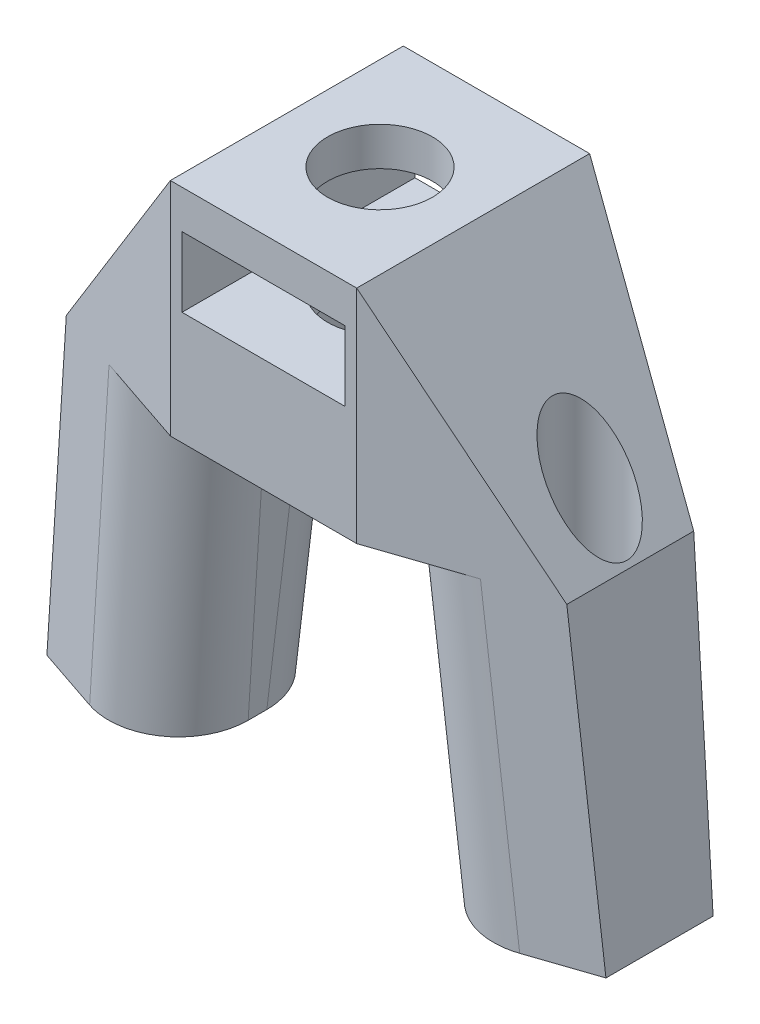
ISO-10303-21;
HEADER;
FILE_DESCRIPTION(('STEP AP214'),'2;1');
FILE_NAME('part.step','',(''),(''),'','','');
FILE_SCHEMA(('AUTOMOTIVE_DESIGN { 1 0 10303 214 1 1 1 1 }'));
ENDSEC;
DATA;
#1=APPLICATION_CONTEXT('core data for automotive mechanical design processes');
#2=APPLICATION_PROTOCOL_DEFINITION('international standard','automotive_design',2000,#1);
#3=PRODUCT_CONTEXT('',#1,'mechanical');
#4=PRODUCT('Part','Part','',(#3));
#5=PRODUCT_RELATED_PRODUCT_CATEGORY('part','',(#4));
#6=PRODUCT_DEFINITION_FORMATION('','',#4);
#7=PRODUCT_DEFINITION_CONTEXT('part definition',#1,'design');
#8=PRODUCT_DEFINITION('design','',#6,#7);
#9=PRODUCT_DEFINITION_SHAPE('','',#8);
#10=(LENGTH_UNIT() NAMED_UNIT(*) SI_UNIT(.MILLI.,.METRE.));
#11=(NAMED_UNIT(*) PLANE_ANGLE_UNIT() SI_UNIT($,.RADIAN.));
#12=(NAMED_UNIT(*) SI_UNIT($,.STERADIAN.) SOLID_ANGLE_UNIT());
#13=UNCERTAINTY_MEASURE_WITH_UNIT(LENGTH_MEASURE(1.E-05),#10,'distance_accuracy_value','');
#14=(GEOMETRIC_REPRESENTATION_CONTEXT(3) GLOBAL_UNCERTAINTY_ASSIGNED_CONTEXT((#13)) GLOBAL_UNIT_ASSIGNED_CONTEXT((#10,
#11,#12)) REPRESENTATION_CONTEXT('',''));
#15=CARTESIAN_POINT('',(0.,0.,0.));
#16=DIRECTION('',(0.,0.,1.));
#17=DIRECTION('',(1.,0.,0.));
#18=AXIS2_PLACEMENT_3D('',#15,#16,#17);
#19=CARTESIAN_POINT('',(0.,0.,-5.));
#20=DIRECTION('',(0.,0.,-1.));
#21=DIRECTION('',(-1.,0.,0.));
#22=AXIS2_PLACEMENT_3D('',#19,#20,#21);
#23=PLANE('',#22);
#24=DIRECTION('',(0.,-1.,0.));
#25=VECTOR('',#24,1.);
#26=CARTESIAN_POINT('',(3.5,0.,-5.));
#27=LINE('',#26,#25);
#28=CARTESIAN_POINT('',(3.5,15.0638674027608,-5.));
#29=VERTEX_POINT('',#28);
#30=CARTESIAN_POINT('',(3.5,12.0638674027608,-5.));
#31=VERTEX_POINT('',#30);
#32=EDGE_CURVE('E353',#29,#31,#27,.T.);
#33=ORIENTED_EDGE('',*,*,#32,.F.);
#34=DIRECTION('',(1.,0.,0.));
#35=VECTOR('',#34,1.);
#36=CARTESIAN_POINT('',(0.,15.0638674027608,-5.));
#37=LINE('',#36,#35);
#38=CARTESIAN_POINT('',(-3.5,15.0638674027608,-5.));
#39=VERTEX_POINT('',#38);
#40=EDGE_CURVE('E231',#39,#29,#37,.T.);
#41=ORIENTED_EDGE('',*,*,#40,.F.);
#42=DIRECTION('',(0.,1.,0.));
#43=VECTOR('',#42,1.);
#44=CARTESIAN_POINT('',(-3.5,0.,-5.));
#45=LINE('',#44,#43);
#46=CARTESIAN_POINT('',(-3.5,12.0638674027608,-5.));
#47=VERTEX_POINT('',#46);
#48=EDGE_CURVE('E350',#47,#39,#45,.T.);
#49=ORIENTED_EDGE('',*,*,#48,.F.);
#50=DIRECTION('',(-1.,0.,0.));
#51=VECTOR('',#50,1.);
#52=CARTESIAN_POINT('',(0.,12.0638674027608,-5.));
#53=LINE('',#52,#51);
#54=EDGE_CURVE('E236',#31,#47,#53,.T.);
#55=ORIENTED_EDGE('',*,*,#54,.F.);
#56=EDGE_LOOP('',(#33,#41,#49,#55));
#57=FACE_BOUND('',#56,.T.);
#58=DIRECTION('',(1.,0.,0.));
#59=VECTOR('',#58,1.);
#60=CARTESIAN_POINT('',(-4.,7.21386740276083,-5.));
#61=LINE('',#60,#59);
#62=CARTESIAN_POINT('',(-4.,7.21386740276083,-5.));
#63=VERTEX_POINT('',#62);
#64=CARTESIAN_POINT('',(4.,7.21386740276075,-5.));
#65=VERTEX_POINT('',#64);
#66=EDGE_CURVE('E219',#63,#65,#61,.T.);
#67=ORIENTED_EDGE('',*,*,#66,.F.);
#68=DIRECTION('',(0.,-1.,0.));
#69=VECTOR('',#68,1.);
#70=CARTESIAN_POINT('',(-4.,16.7138674027608,-5.));
#71=LINE('',#70,#69);
#72=CARTESIAN_POINT('',(-4.,16.7138674027608,-5.));
#73=VERTEX_POINT('',#72);
#74=EDGE_CURVE('E368',#73,#63,#71,.T.);
#75=ORIENTED_EDGE('',*,*,#74,.F.);
#76=DIRECTION('',(-1.,0.,0.));
#77=VECTOR('',#76,1.);
#78=CARTESIAN_POINT('',(-4.,16.7138674027608,-5.));
#79=LINE('',#78,#77);
#80=CARTESIAN_POINT('',(4.,16.7138674027608,-5.));
#81=VERTEX_POINT('',#80);
#82=EDGE_CURVE('E202',#81,#73,#79,.T.);
#83=ORIENTED_EDGE('',*,*,#82,.F.);
#84=DIRECTION('',(0.,-1.,0.));
#85=VECTOR('',#84,1.);
#86=CARTESIAN_POINT('',(4.,16.7138674027608,-5.));
#87=LINE('',#86,#85);
#88=EDGE_CURVE('E308',#81,#65,#87,.T.);
#89=ORIENTED_EDGE('',*,*,#88,.T.);
#90=EDGE_LOOP('',(#67,#75,#83,#89));
#91=FACE_BOUND('',#90,.T.);
#92=ADVANCED_FACE('F32',(#57,#91),#23,.T.);
#93=CARTESIAN_POINT('',(0.,0.,5.));
#94=DIRECTION('',(0.,0.,-1.));
#95=DIRECTION('',(-1.,0.,0.));
#96=AXIS2_PLACEMENT_3D('',#93,#94,#95);
#97=PLANE('',#96);
#98=DIRECTION('',(-1.,0.,0.));
#99=VECTOR('',#98,1.);
#100=CARTESIAN_POINT('',(-3.5,15.0638674027608,5.));
#101=LINE('',#100,#99);
#102=CARTESIAN_POINT('',(3.5,15.0638674027608,5.));
#103=VERTEX_POINT('',#102);
#104=CARTESIAN_POINT('',(-3.5,15.0638674027608,5.));
#105=VERTEX_POINT('',#104);
#106=EDGE_CURVE('E331',#103,#105,#101,.T.);
#107=ORIENTED_EDGE('',*,*,#106,.F.);
#108=DIRECTION('',(0.,1.,0.));
#109=VECTOR('',#108,1.);
#110=CARTESIAN_POINT('',(3.5,12.0638674027608,5.));
#111=LINE('',#110,#109);
#112=CARTESIAN_POINT('',(3.5,12.0638674027608,5.));
#113=VERTEX_POINT('',#112);
#114=EDGE_CURVE('E329',#113,#103,#111,.T.);
#115=ORIENTED_EDGE('',*,*,#114,.F.);
#116=DIRECTION('',(1.,0.,0.));
#117=VECTOR('',#116,1.);
#118=CARTESIAN_POINT('',(-3.5,12.0638674027608,5.));
#119=LINE('',#118,#117);
#120=CARTESIAN_POINT('',(-3.5,12.0638674027608,5.));
#121=VERTEX_POINT('',#120);
#122=EDGE_CURVE('E337',#121,#113,#119,.T.);
#123=ORIENTED_EDGE('',*,*,#122,.F.);
#124=DIRECTION('',(0.,-1.,0.));
#125=VECTOR('',#124,1.);
#126=CARTESIAN_POINT('',(-3.5,12.0638674027608,5.));
#127=LINE('',#126,#125);
#128=EDGE_CURVE('E334',#105,#121,#127,.T.);
#129=ORIENTED_EDGE('',*,*,#128,.F.);
#130=EDGE_LOOP('',(#107,#115,#123,#129));
#131=FACE_BOUND('',#130,.T.);
#132=DIRECTION('',(0.,-1.,0.));
#133=VECTOR('',#132,1.);
#134=CARTESIAN_POINT('',(-4.,16.7138674027608,5.));
#135=LINE('',#134,#133);
#136=CARTESIAN_POINT('',(-4.,16.7138674027608,5.));
#137=VERTEX_POINT('',#136);
#138=CARTESIAN_POINT('',(-3.99999999999998,7.21386740276123,5.00000000000001));
#139=VERTEX_POINT('',#138);
#140=EDGE_CURVE('E168',#137,#139,#135,.T.);
#141=ORIENTED_EDGE('',*,*,#140,.T.);
#142=DIRECTION('',(1.,0.,0.));
#143=VECTOR('',#142,1.);
#144=CARTESIAN_POINT('',(-4.,7.21386740276083,5.));
#145=LINE('',#144,#143);
#146=CARTESIAN_POINT('',(3.99999999999998,7.21386740276123,5.00000000000001));
#147=VERTEX_POINT('',#146);
#148=EDGE_CURVE('E216',#139,#147,#145,.T.);
#149=ORIENTED_EDGE('',*,*,#148,.T.);
#150=DIRECTION('',(0.,-1.,0.));
#151=VECTOR('',#150,1.);
#152=CARTESIAN_POINT('',(4.,16.7138674027608,5.));
#153=LINE('',#152,#151);
#154=CARTESIAN_POINT('',(4.,16.7138674027608,5.));
#155=VERTEX_POINT('',#154);
#156=EDGE_CURVE('E206',#155,#147,#153,.T.);
#157=ORIENTED_EDGE('',*,*,#156,.F.);
#158=DIRECTION('',(1.,0.,0.));
#159=VECTOR('',#158,1.);
#160=CARTESIAN_POINT('',(-4.,16.7138674027608,5.));
#161=LINE('',#160,#159);
#162=EDGE_CURVE('E200',#137,#155,#161,.T.);
#163=ORIENTED_EDGE('',*,*,#162,.F.);
#164=EDGE_LOOP('',(#141,#149,#157,#163));
#165=FACE_BOUND('',#164,.T.);
#166=ADVANCED_FACE('F205',(#131,#165),#97,.F.);
#167=CARTESIAN_POINT('',(-10.7436401353757,7.18802311367852,29.3515913237718));
#168=DIRECTION('',(-0.816179352712969,0.577798636382122,0.));
#169=DIRECTION('',(-0.577798636382122,-0.816179352712969,0.));
#170=AXIS2_PLACEMENT_3D('',#167,#168,#169);
#171=PLANE('',#170);
#172=CARTESIAN_POINT('',(-9.,9.65103182890533,0.));
#173=DIRECTION('',(-0.816179352712969,0.577798636382122,0.));
#174=DIRECTION('',(-0.577798636382122,-0.816179352712969,0.));
#175=AXIS2_PLACEMENT_3D('',#172,#173,#174);
#176=ELLIPSE('',#175,2.7691307996474,1.6);
#177=CARTESIAN_POINT('',(-10.6,7.39092444527157,0.));
#178=VERTEX_POINT('',#177);
#179=EDGE_CURVE('E383',#178,#178,#176,.F.);
#180=ORIENTED_EDGE('',*,*,#179,.T.);
#181=EDGE_LOOP('',(#180));
#182=FACE_BOUND('',#181,.T.);
#183=DIRECTION('',(0.,0.,-1.));
#184=VECTOR('',#183,1.);
#185=CARTESIAN_POINT('',(-10.7436401353757,7.18802311367852,29.3515913237718));
#186=LINE('',#185,#184);
#187=CARTESIAN_POINT('',(-10.7436401353757,7.18802311367852,2.72402145431069));
#188=VERTEX_POINT('',#187);
#189=CARTESIAN_POINT('',(-10.7436401353757,7.18802311367852,-2.72402145431069));
#190=VERTEX_POINT('',#189);
#191=EDGE_CURVE('E191',#188,#190,#186,.T.);
#192=ORIENTED_EDGE('',*,*,#191,.F.);
#193=DIRECTION('',(0.567116171588462,0.801089654240746,0.191401707911106));
#194=VECTOR('',#193,1.);
#195=CARTESIAN_POINT('',(-7.85329720687722,11.2708264848867,3.69951219267894));
#196=LINE('',#195,#194);
#197=EDGE_CURVE('E173',#188,#137,#196,.T.);
#198=ORIENTED_EDGE('',*,*,#197,.T.);
#199=DIRECTION('',(0.,0.,1.));
#200=VECTOR('',#199,1.);
#201=CARTESIAN_POINT('',(-4.,16.7138674027608,5.));
#202=LINE('',#201,#200);
#203=EDGE_CURVE('E189',#73,#137,#202,.T.);
#204=ORIENTED_EDGE('',*,*,#203,.F.);
#205=DIRECTION('',(-0.567116171588462,-0.801089654240746,0.191401707911106));
#206=VECTOR('',#205,1.);
#207=CARTESIAN_POINT('',(-14.2253517983208,2.2698717154873,-1.54894376806672));
#208=LINE('',#207,#206);
#209=EDGE_CURVE('E378',#73,#190,#208,.T.);
#210=ORIENTED_EDGE('',*,*,#209,.T.);
#211=EDGE_LOOP('',(#192,#198,#204,#210));
#212=FACE_BOUND('',#211,.T.);
#213=ADVANCED_FACE('F187',(#182,#212),#171,.T.);
#214=CARTESIAN_POINT('',(-12.,-6.28613259723917,29.3515913237718));
#215=DIRECTION('',(-0.995681087961558,0.0928394909275632,0.));
#216=DIRECTION('',(-0.0928394909275632,-0.995681087961558,0.));
#217=AXIS2_PLACEMENT_3D('',#214,#215,#216);
#218=PLANE('',#217);
#219=DIRECTION('',(0.,0.,-1.));
#220=VECTOR('',#219,1.);
#221=CARTESIAN_POINT('',(-12.,-6.28613259723917,29.3515913237718));
#222=LINE('',#221,#220);
#223=CARTESIAN_POINT('',(-12.,-6.28613259723917,2.3));
#224=VERTEX_POINT('',#223);
#225=CARTESIAN_POINT('',(-12.,-6.28613259723917,-2.3));
#226=VERTEX_POINT('',#225);
#227=EDGE_CURVE('E313',#224,#226,#222,.T.);
#228=ORIENTED_EDGE('',*,*,#227,.F.);
#229=DIRECTION('',(0.0927939505980937,0.995192678941438,0.0313179583268566));
#230=VECTOR('',#229,1.);
#231=CARTESIAN_POINT('',(-11.9213849084719,-5.44300475281822,2.32653259339073));
#232=LINE('',#231,#230);
#233=EDGE_CURVE('E193',#224,#188,#232,.T.);
#234=ORIENTED_EDGE('',*,*,#233,.T.);
#235=ORIENTED_EDGE('',*,*,#191,.T.);
#236=DIRECTION('',(-0.0927939505980937,-0.995192678941438,0.0313179583268566));
#237=VECTOR('',#236,1.);
#238=CARTESIAN_POINT('',(-12.0919832300861,-7.27263049475301,-2.26895565984596));
#239=LINE('',#238,#237);
#240=EDGE_CURVE('E180',#190,#226,#239,.T.);
#241=ORIENTED_EDGE('',*,*,#240,.T.);
#242=EDGE_LOOP('',(#228,#234,#235,#241));
#243=FACE_BOUND('',#242,.T.);
#244=ADVANCED_FACE('F413',(#243),#218,.T.);
#245=CARTESIAN_POINT('',(-5.25876964288639,-6.28613259723917,29.3515913237718));
#246=DIRECTION('',(0.,-1.,0.));
#247=DIRECTION('',(1.,0.,0.));
#248=AXIS2_PLACEMENT_3D('',#245,#246,#247);
#249=PLANE('',#248);
#250=CARTESIAN_POINT('',(-9.00000000000001,-6.28613259723917,0.));
#251=DIRECTION('',(0.,1.,0.));
#252=DIRECTION('',(-1.,0.,0.));
#253=AXIS2_PLACEMENT_3D('',#250,#251,#252);
#254=CIRCLE('',#253,1.6);
#255=CARTESIAN_POINT('',(-10.6,-6.28613259723917,0.));
#256=VERTEX_POINT('',#255);
#257=EDGE_CURVE('E192',#256,#256,#254,.T.);
#258=ORIENTED_EDGE('',*,*,#257,.T.);
#259=EDGE_LOOP('',(#258));
#260=FACE_BOUND('',#259,.T.);
#261=DIRECTION('',(0.947492278987199,0.,-0.31977864415818));
#262=VECTOR('',#261,1.);
#263=CARTESIAN_POINT('',(-4.,-6.28613259723917,-5.));
#264=LINE('',#263,#262);
#265=CARTESIAN_POINT('',(-9.23111851321019,-6.28613259723917,-3.23449750179156));
#266=VERTEX_POINT('',#265);
#267=EDGE_CURVE('E370',#226,#266,#264,.T.);
#268=ORIENTED_EDGE('',*,*,#267,.T.);
#269=CARTESIAN_POINT('',(-8.27178258073565,-6.28613259723917,-0.392020664829971));
#270=DIRECTION('',(0.,-1.,0.));
#271=DIRECTION('',(0.947492278987199,0.,-0.31977864415818));
#272=AXIS2_PLACEMENT_3D('',#269,#270,#271);
#273=ELLIPSE('',#272,3.01449162908938,3.);
#274=CARTESIAN_POINT('',(-5.25876964288639,-6.28613259723917,-0.400785429793018));
#275=VERTEX_POINT('',#274);
#276=EDGE_CURVE('E258',#266,#275,#273,.T.);
#277=ORIENTED_EDGE('',*,*,#276,.T.);
#278=DIRECTION('',(0.,0.,-1.));
#279=VECTOR('',#278,1.);
#280=CARTESIAN_POINT('',(-5.25876964288639,-6.28613259723917,29.3515913237718));
#281=LINE('',#280,#279);
#282=CARTESIAN_POINT('',(-5.25876964288639,-6.28613259723917,0.400785429793014));
#283=VERTEX_POINT('',#282);
#284=EDGE_CURVE('E386',#283,#275,#281,.T.);
#285=ORIENTED_EDGE('',*,*,#284,.F.);
#286=CARTESIAN_POINT('',(-8.27178258073565,-6.28613259723917,0.392020664829965));
#287=DIRECTION('',(0.,-1.,0.));
#288=DIRECTION('',(-0.947492278987199,0.,-0.319778644158179));
#289=AXIS2_PLACEMENT_3D('',#286,#287,#288);
#290=ELLIPSE('',#289,3.01449162908938,3.);
#291=CARTESIAN_POINT('',(-9.23111851321019,-6.28613259723917,3.23449750179156));
#292=VERTEX_POINT('',#291);
#293=EDGE_CURVE('E256',#283,#292,#290,.T.);
#294=ORIENTED_EDGE('',*,*,#293,.T.);
#295=DIRECTION('',(-0.947492278987199,0.,-0.319778644158179));
#296=VECTOR('',#295,1.);
#297=CARTESIAN_POINT('',(-12.,-6.28613259723917,2.3));
#298=LINE('',#297,#296);
#299=EDGE_CURVE('E181',#292,#224,#298,.T.);
#300=ORIENTED_EDGE('',*,*,#299,.T.);
#301=ORIENTED_EDGE('',*,*,#227,.T.);
#302=EDGE_LOOP('',(#268,#277,#285,#294,#300,#301));
#303=FACE_BOUND('',#302,.T.);
#304=ADVANCED_FACE('F405',(#260,#303),#249,.T.);
#305=CARTESIAN_POINT('',(-4.,7.21386740276083,29.3515913237718));
#306=DIRECTION('',(0.995681087961558,-0.0928394909275634,0.));
#307=DIRECTION('',(0.0928394909275634,0.995681087961558,0.));
#308=AXIS2_PLACEMENT_3D('',#305,#306,#307);
#309=PLANE('',#308);
#310=ORIENTED_EDGE('',*,*,#284,.T.);
#311=DIRECTION('',(0.0927939505980939,0.995192678941438,-0.0313179583268566));
#312=VECTOR('',#311,1.);
#313=CARTESIAN_POINT('',(-4.08769850972436,6.27332209491236,-0.796021937235207));
#314=LINE('',#313,#312);
#315=CARTESIAN_POINT('',(-4.,7.21386740276083,-0.825620184267176));
#316=VERTEX_POINT('',#315);
#317=EDGE_CURVE('E250',#275,#316,#314,.T.);
#318=ORIENTED_EDGE('',*,*,#317,.T.);
#319=DIRECTION('',(0.,0.,1.));
#320=VECTOR('',#319,1.);
#321=CARTESIAN_POINT('',(-4.,7.21386740276083,-5.));
#322=LINE('',#321,#320);
#323=CARTESIAN_POINT('',(-4.,7.21386740276083,0.82562018426717));
#324=VERTEX_POINT('',#323);
#325=EDGE_CURVE('E221',#316,#324,#322,.T.);
#326=ORIENTED_EDGE('',*,*,#325,.T.);
#327=DIRECTION('',(-0.0927939505980939,-0.995192678941438,-0.0313179583268566));
#328=VECTOR('',#327,1.);
#329=CARTESIAN_POINT('',(-3.91710018811021,8.10294783684715,0.853598870779973));
#330=LINE('',#329,#328);
#331=EDGE_CURVE('E247',#324,#283,#330,.T.);
#332=ORIENTED_EDGE('',*,*,#331,.T.);
#333=EDGE_LOOP('',(#310,#318,#326,#332));
#334=FACE_BOUND('',#333,.T.);
#335=ADVANCED_FACE('F402',(#334),#309,.T.);
#336=CARTESIAN_POINT('',(0.,0.713867402760828,0.));
#337=DIRECTION('',(0.,1.,0.));
#338=DIRECTION('',(0.,0.,1.));
#339=AXIS2_PLACEMENT_3D('',#336,#337,#338);
#340=CYLINDRICAL_SURFACE('',#339,2.25);
#341=CARTESIAN_POINT('',(0.,12.0638674027608,0.));
#342=DIRECTION('',(0.,-1.,0.));
#343=DIRECTION('',(0.,0.,-1.));
#344=AXIS2_PLACEMENT_3D('',#341,#342,#343);
#345=CIRCLE('',#344,2.25);
#346=CARTESIAN_POINT('',(0.,12.0638674027608,-2.25));
#347=VERTEX_POINT('',#346);
#348=EDGE_CURVE('E233',#347,#347,#345,.F.);
#349=ORIENTED_EDGE('',*,*,#348,.T.);
#350=EDGE_LOOP('',(#349));
#351=FACE_BOUND('',#350,.T.);
#352=CARTESIAN_POINT('',(0.,10.4138674027608,0.));
#353=DIRECTION('',(0.,-1.,0.));
#354=DIRECTION('',(0.,0.,-1.));
#355=AXIS2_PLACEMENT_3D('',#352,#353,#354);
#356=CIRCLE('',#355,2.25);
#357=CARTESIAN_POINT('',(0.,10.4138674027608,-2.25));
#358=VERTEX_POINT('',#357);
#359=EDGE_CURVE('E358',#358,#358,#356,.T.);
#360=ORIENTED_EDGE('',*,*,#359,.T.);
#361=EDGE_LOOP('',(#360));
#362=FACE_BOUND('',#361,.T.);
#363=ADVANCED_FACE('F438',(#351,#362),#340,.F.);
#364=CARTESIAN_POINT('',(-4.,7.21386740276083,-5.));
#365=DIRECTION('',(0.,-1.,0.));
#366=DIRECTION('',(0.,0.,-1.));
#367=AXIS2_PLACEMENT_3D('',#364,#365,#366);
#368=PLANE('',#367);
#369=CARTESIAN_POINT('',(0.,7.21386740276083,0.));
#370=DIRECTION('',(0.,-1.,0.));
#371=DIRECTION('',(0.,0.,-1.));
#372=AXIS2_PLACEMENT_3D('',#369,#370,#371);
#373=CIRCLE('',#372,3.7);
#374=CARTESIAN_POINT('',(0.,7.21386740276083,-3.7));
#375=VERTEX_POINT('',#374);
#376=EDGE_CURVE('E208',#375,#375,#373,.T.);
#377=ORIENTED_EDGE('',*,*,#376,.F.);
#378=EDGE_LOOP('',(#377));
#379=FACE_BOUND('',#378,.T.);
#380=ORIENTED_EDGE('',*,*,#66,.T.);
#381=DIRECTION('',(-0.947492278987199,0.,-0.31977864415818));
#382=VECTOR('',#381,1.);
#383=CARTESIAN_POINT('',(-3.18193294992285,7.21386740276083,-7.42390237059896));
#384=LINE('',#383,#382);
#385=CARTESIAN_POINT('',(7.9723488703238,7.21386740276083,-3.65933225626572));
#386=VERTEX_POINT('',#385);
#387=EDGE_CURVE('E273',#386,#65,#384,.T.);
#388=ORIENTED_EDGE('',*,*,#387,.F.);
#389=CARTESIAN_POINT('',(7.01301293784926,7.21386740276083,-0.816855419304128));
#390=DIRECTION('',(0.,-1.,0.));
#391=DIRECTION('',(0.947492278987199,0.,0.319778644158179));
#392=AXIS2_PLACEMENT_3D('',#389,#390,#391);
#393=ELLIPSE('',#392,3.01449162908938,3.);
#394=CARTESIAN_POINT('',(4.,7.21386740276083,-0.825620184267176));
#395=VERTEX_POINT('',#394);
#396=EDGE_CURVE('E40',#386,#395,#393,.F.);
#397=ORIENTED_EDGE('',*,*,#396,.T.);
#398=DIRECTION('',(0.,0.,1.));
#399=VECTOR('',#398,1.);
#400=CARTESIAN_POINT('',(4.,7.21386740276083,-5.));
#401=LINE('',#400,#399);
#402=CARTESIAN_POINT('',(4.,7.21386740276083,0.82562018426717));
#403=VERTEX_POINT('',#402);
#404=EDGE_CURVE('E222',#395,#403,#401,.T.);
#405=ORIENTED_EDGE('',*,*,#404,.T.);
#406=CARTESIAN_POINT('',(7.01301293784926,7.21386740276083,0.816855419304122));
#407=DIRECTION('',(0.,-1.,0.));
#408=DIRECTION('',(-0.947492278987199,0.,0.319778644158179));
#409=AXIS2_PLACEMENT_3D('',#406,#407,#408);
#410=ELLIPSE('',#409,3.01449162908938,3.);
#411=CARTESIAN_POINT('',(7.9723488703238,7.21386740276082,3.65933225626572));
#412=VERTEX_POINT('',#411);
#413=EDGE_CURVE('E11',#403,#412,#410,.F.);
#414=ORIENTED_EDGE('',*,*,#413,.T.);
#415=DIRECTION('',(0.947492278987199,0.,-0.319778644158179));
#416=VECTOR('',#415,1.);
#417=CARTESIAN_POINT('',(-0.152054986674151,7.21386740276083,6.40131855800252));
#418=LINE('',#417,#416);
#419=EDGE_CURVE('E46',#147,#412,#418,.T.);
#420=ORIENTED_EDGE('',*,*,#419,.F.);
#421=ORIENTED_EDGE('',*,*,#148,.F.);
#422=DIRECTION('',(0.947492278987199,0.,0.319778644158179));
#423=VECTOR('',#422,1.);
#424=CARTESIAN_POINT('',(-12.,7.21386740276083,2.3));
#425=LINE('',#424,#423);
#426=CARTESIAN_POINT('',(-7.9723488703238,7.21386740276083,3.65933225626572));
#427=VERTEX_POINT('',#426);
#428=EDGE_CURVE('E176',#427,#139,#425,.T.);
#429=ORIENTED_EDGE('',*,*,#428,.F.);
#430=CARTESIAN_POINT('',(-7.01301293784926,7.21386740276083,0.816855419304122));
#431=DIRECTION('',(0.,-1.,0.));
#432=DIRECTION('',(-0.947492278987199,0.,-0.319778644158179));
#433=AXIS2_PLACEMENT_3D('',#430,#431,#432);
#434=ELLIPSE('',#433,3.01449162908938,3.);
#435=EDGE_CURVE('E283',#427,#324,#434,.F.);
#436=ORIENTED_EDGE('',*,*,#435,.T.);
#437=ORIENTED_EDGE('',*,*,#325,.F.);
#438=CARTESIAN_POINT('',(-7.01301293784926,7.21386740276083,-0.816855419304128));
#439=DIRECTION('',(0.,-1.,0.));
#440=DIRECTION('',(0.947492278987199,0.,-0.319778644158179));
#441=AXIS2_PLACEMENT_3D('',#438,#439,#440);
#442=ELLIPSE('',#441,3.01449162908938,3.);
#443=CARTESIAN_POINT('',(-7.9723488703238,7.21386740276082,-3.65933225626572));
#444=VERTEX_POINT('',#443);
#445=EDGE_CURVE('E281',#316,#444,#442,.F.);
#446=ORIENTED_EDGE('',*,*,#445,.T.);
#447=DIRECTION('',(-0.947492278987199,0.,0.31977864415818));
#448=VECTOR('',#447,1.);
#449=CARTESIAN_POINT('',(-4.,7.21386740276083,-5.));
#450=LINE('',#449,#448);
#451=EDGE_CURVE('E53',#63,#444,#450,.T.);
#452=ORIENTED_EDGE('',*,*,#451,.F.);
#453=EDGE_LOOP('',(#380,#388,#397,#405,#414,#420,#421,#429,#436,#437,#446,#452));
#454=FACE_BOUND('',#453,.T.);
#455=ADVANCED_FACE('F286',(#379,#454),#368,.T.);
#456=CARTESIAN_POINT('',(0.,10.4138674027608,0.));
#457=DIRECTION('',(0.,-1.,0.));
#458=DIRECTION('',(0.,0.,-1.));
#459=AXIS2_PLACEMENT_3D('',#456,#457,#458);
#460=CYLINDRICAL_SURFACE('',#459,3.7);
#461=CARTESIAN_POINT('',(0.,10.4138674027608,0.));
#462=DIRECTION('',(0.,-1.,0.));
#463=DIRECTION('',(0.,0.,-1.));
#464=AXIS2_PLACEMENT_3D('',#461,#462,#463);
#465=CIRCLE('',#464,3.7);
#466=CARTESIAN_POINT('',(0.,10.4138674027608,-3.7));
#467=VERTEX_POINT('',#466);
#468=EDGE_CURVE('E211',#467,#467,#465,.T.);
#469=ORIENTED_EDGE('',*,*,#468,.F.);
#470=EDGE_LOOP('',(#469));
#471=FACE_BOUND('',#470,.T.);
#472=ORIENTED_EDGE('',*,*,#376,.T.);
#473=EDGE_LOOP('',(#472));
#474=FACE_BOUND('',#473,.T.);
#475=ADVANCED_FACE('F437',(#471,#474),#460,.F.);
#476=CARTESIAN_POINT('',(0.,10.4138674027608,0.));
#477=DIRECTION('',(0.,-1.,0.));
#478=DIRECTION('',(0.,0.,-1.));
#479=AXIS2_PLACEMENT_3D('',#476,#477,#478);
#480=PLANE('',#479);
#481=ORIENTED_EDGE('',*,*,#359,.F.);
#482=EDGE_LOOP('',(#481));
#483=FACE_BOUND('',#482,.T.);
#484=ORIENTED_EDGE('',*,*,#468,.T.);
#485=EDGE_LOOP('',(#484));
#486=FACE_BOUND('',#485,.T.);
#487=ADVANCED_FACE('F491',(#483,#486),#480,.T.);
#488=CARTESIAN_POINT('',(0.,16.7138674027608,0.));
#489=DIRECTION('',(0.,-1.,0.));
#490=DIRECTION('',(0.,0.,-1.));
#491=AXIS2_PLACEMENT_3D('',#488,#489,#490);
#492=PLANE('',#491);
#493=CARTESIAN_POINT('',(0.,16.7138674027608,0.));
#494=DIRECTION('',(0.,1.,0.));
#495=DIRECTION('',(0.,0.,1.));
#496=AXIS2_PLACEMENT_3D('',#493,#494,#495);
#497=CIRCLE('',#496,2.25);
#498=CARTESIAN_POINT('',(0.,16.7138674027608,2.25));
#499=VERTEX_POINT('',#498);
#500=EDGE_CURVE('E355',#499,#499,#497,.T.);
#501=ORIENTED_EDGE('',*,*,#500,.F.);
#502=EDGE_LOOP('',(#501));
#503=FACE_BOUND('',#502,.T.);
#504=DIRECTION('',(0.,0.,-1.));
#505=VECTOR('',#504,1.);
#506=CARTESIAN_POINT('',(4.,16.7138674027608,5.));
#507=LINE('',#506,#505);
#508=EDGE_CURVE('E361',#155,#81,#507,.T.);
#509=ORIENTED_EDGE('',*,*,#508,.T.);
#510=ORIENTED_EDGE('',*,*,#82,.T.);
#511=ORIENTED_EDGE('',*,*,#203,.T.);
#512=ORIENTED_EDGE('',*,*,#162,.T.);
#513=EDGE_LOOP('',(#509,#510,#511,#512));
#514=FACE_BOUND('',#513,.T.);
#515=ADVANCED_FACE('F199',(#503,#514),#492,.F.);
#516=CARTESIAN_POINT('',(0.,15.0638674027608,0.));
#517=DIRECTION('',(0.,1.,0.));
#518=DIRECTION('',(0.,0.,1.));
#519=AXIS2_PLACEMENT_3D('',#516,#517,#518);
#520=CIRCLE('',#519,2.25);
#521=CARTESIAN_POINT('',(0.,15.0638674027608,2.25));
#522=VERTEX_POINT('',#521);
#523=EDGE_CURVE('E228',#522,#522,#520,.F.);
#524=ORIENTED_EDGE('',*,*,#523,.T.);
#525=EDGE_LOOP('',(#524));
#526=FACE_BOUND('',#525,.T.);
#527=ORIENTED_EDGE('',*,*,#500,.T.);
#528=EDGE_LOOP('',(#527));
#529=FACE_BOUND('',#528,.T.);
#530=ADVANCED_FACE('F477',(#526,#529),#340,.F.);
#531=CARTESIAN_POINT('',(-3.5,12.0638674027608,-11.));
#532=DIRECTION('',(0.,-1.,0.));
#533=DIRECTION('',(0.,0.,-1.));
#534=AXIS2_PLACEMENT_3D('',#531,#532,#533);
#535=PLANE('',#534);
#536=ORIENTED_EDGE('',*,*,#54,.T.);
#537=DIRECTION('',(0.,0.,1.));
#538=VECTOR('',#537,1.);
#539=CARTESIAN_POINT('',(-3.5,12.0638674027608,-11.));
#540=LINE('',#539,#538);
#541=EDGE_CURVE('E342',#47,#121,#540,.T.);
#542=ORIENTED_EDGE('',*,*,#541,.T.);
#543=ORIENTED_EDGE('',*,*,#122,.T.);
#544=DIRECTION('',(0.,0.,1.));
#545=VECTOR('',#544,1.);
#546=CARTESIAN_POINT('',(3.5,12.0638674027608,-11.));
#547=LINE('',#546,#545);
#548=EDGE_CURVE('E232',#31,#113,#547,.T.);
#549=ORIENTED_EDGE('',*,*,#548,.F.);
#550=EDGE_LOOP('',(#536,#542,#543,#549));
#551=FACE_BOUND('',#550,.T.);
#552=ORIENTED_EDGE('',*,*,#348,.F.);
#553=EDGE_LOOP('',(#552));
#554=FACE_BOUND('',#553,.T.);
#555=ADVANCED_FACE('F474',(#551,#554),#535,.F.);
#556=CARTESIAN_POINT('',(-3.5,15.0638674027608,-11.));
#557=DIRECTION('',(0.,1.,0.));
#558=DIRECTION('',(0.,0.,1.));
#559=AXIS2_PLACEMENT_3D('',#556,#557,#558);
#560=PLANE('',#559);
#561=ORIENTED_EDGE('',*,*,#40,.T.);
#562=DIRECTION('',(0.,0.,1.));
#563=VECTOR('',#562,1.);
#564=CARTESIAN_POINT('',(3.5,15.0638674027608,-11.));
#565=LINE('',#564,#563);
#566=EDGE_CURVE('E340',#29,#103,#565,.T.);
#567=ORIENTED_EDGE('',*,*,#566,.T.);
#568=ORIENTED_EDGE('',*,*,#106,.T.);
#569=DIRECTION('',(0.,0.,1.));
#570=VECTOR('',#569,1.);
#571=CARTESIAN_POINT('',(-3.5,15.0638674027608,-11.));
#572=LINE('',#571,#570);
#573=EDGE_CURVE('E344',#39,#105,#572,.T.);
#574=ORIENTED_EDGE('',*,*,#573,.F.);
#575=EDGE_LOOP('',(#561,#567,#568,#574));
#576=FACE_BOUND('',#575,.T.);
#577=ORIENTED_EDGE('',*,*,#523,.F.);
#578=EDGE_LOOP('',(#577));
#579=FACE_BOUND('',#578,.T.);
#580=ADVANCED_FACE('F476',(#576,#579),#560,.F.);
#581=CARTESIAN_POINT('',(3.5,12.0638674027608,-11.));
#582=DIRECTION('',(1.,0.,0.));
#583=DIRECTION('',(0.,0.,-1.));
#584=AXIS2_PLACEMENT_3D('',#581,#582,#583);
#585=PLANE('',#584);
#586=ORIENTED_EDGE('',*,*,#32,.T.);
#587=ORIENTED_EDGE('',*,*,#548,.T.);
#588=ORIENTED_EDGE('',*,*,#114,.T.);
#589=ORIENTED_EDGE('',*,*,#566,.F.);
#590=EDGE_LOOP('',(#586,#587,#588,#589));
#591=FACE_BOUND('',#590,.T.);
#592=ADVANCED_FACE('F462',(#591),#585,.F.);
#593=CARTESIAN_POINT('',(-3.5,12.0638674027608,-11.));
#594=DIRECTION('',(-1.,0.,0.));
#595=DIRECTION('',(0.,0.,1.));
#596=AXIS2_PLACEMENT_3D('',#593,#594,#595);
#597=PLANE('',#596);
#598=ORIENTED_EDGE('',*,*,#48,.T.);
#599=ORIENTED_EDGE('',*,*,#573,.T.);
#600=ORIENTED_EDGE('',*,*,#128,.T.);
#601=ORIENTED_EDGE('',*,*,#541,.F.);
#602=EDGE_LOOP('',(#598,#599,#600,#601));
#603=FACE_BOUND('',#602,.T.);
#604=ADVANCED_FACE('F454',(#603),#597,.F.);
#605=CARTESIAN_POINT('',(12.,-6.28613259723917,29.3515913237718));
#606=DIRECTION('',(-0.995681087961558,-0.0928394909275632,0.));
#607=DIRECTION('',(0.0928394909275632,-0.995681087961558,0.));
#608=AXIS2_PLACEMENT_3D('',#605,#606,#607);
#609=PLANE('',#608);
#610=DIRECTION('',(0.,0.,-1.));
#611=VECTOR('',#610,1.);
#612=CARTESIAN_POINT('',(10.7436401353757,7.18802311367852,29.3515913237718));
#613=LINE('',#612,#611);
#614=CARTESIAN_POINT('',(10.7436401353757,7.18802311367852,2.72402145431069));
#615=VERTEX_POINT('',#614);
#616=CARTESIAN_POINT('',(10.7436401353757,7.18802311367852,-2.72402145431069));
#617=VERTEX_POINT('',#616);
#618=EDGE_CURVE('E240',#615,#617,#613,.T.);
#619=ORIENTED_EDGE('',*,*,#618,.F.);
#620=DIRECTION('',(0.0927939505980937,-0.995192678941438,-0.0313179583268566));
#621=VECTOR('',#620,1.);
#622=CARTESIAN_POINT('',(11.9213849084719,-5.44300475281822,2.32653259339073));
#623=LINE('',#622,#621);
#624=CARTESIAN_POINT('',(12.,-6.28613259723917,2.3));
#625=VERTEX_POINT('',#624);
#626=EDGE_CURVE('E319',#615,#625,#623,.T.);
#627=ORIENTED_EDGE('',*,*,#626,.T.);
#628=DIRECTION('',(0.,0.,-1.));
#629=VECTOR('',#628,1.);
#630=CARTESIAN_POINT('',(12.,-6.28613259723917,29.3515913237718));
#631=LINE('',#630,#629);
#632=CARTESIAN_POINT('',(12.,-6.28613259723917,-2.3));
#633=VERTEX_POINT('',#632);
#634=EDGE_CURVE('E326',#625,#633,#631,.T.);
#635=ORIENTED_EDGE('',*,*,#634,.T.);
#636=DIRECTION('',(-0.0927939505980937,0.995192678941438,-0.0313179583268566));
#637=VECTOR('',#636,1.);
#638=CARTESIAN_POINT('',(12.0919832300861,-7.27263049475301,-2.26895565984596));
#639=LINE('',#638,#637);
#640=EDGE_CURVE('E307',#633,#617,#639,.T.);
#641=ORIENTED_EDGE('',*,*,#640,.T.);
#642=EDGE_LOOP('',(#619,#627,#635,#641));
#643=FACE_BOUND('',#642,.T.);
#644=ADVANCED_FACE('F452',(#643),#609,.F.);
#645=CARTESIAN_POINT('',(5.25876964288639,-6.28613259723917,29.3515913237718));
#646=DIRECTION('',(0.,1.,0.));
#647=DIRECTION('',(-1.,0.,0.));
#648=AXIS2_PLACEMENT_3D('',#645,#646,#647);
#649=PLANE('',#648);
#650=CARTESIAN_POINT('',(9.00000000000001,-6.28613259723917,0.));
#651=DIRECTION('',(0.,-1.,0.));
#652=DIRECTION('',(1.,0.,0.));
#653=AXIS2_PLACEMENT_3D('',#650,#651,#652);
#654=CIRCLE('',#653,1.6);
#655=CARTESIAN_POINT('',(10.6,-6.28613259723917,0.));
#656=VERTEX_POINT('',#655);
#657=EDGE_CURVE('E241',#656,#656,#654,.T.);
#658=ORIENTED_EDGE('',*,*,#657,.F.);
#659=EDGE_LOOP('',(#658));
#660=FACE_BOUND('',#659,.T.);
#661=DIRECTION('',(0.,0.,-1.));
#662=VECTOR('',#661,1.);
#663=CARTESIAN_POINT('',(5.25876964288639,-6.28613259723917,29.3515913237718));
#664=LINE('',#663,#662);
#665=CARTESIAN_POINT('',(5.25876964288639,-6.28613259723917,0.400785429793014));
#666=VERTEX_POINT('',#665);
#667=CARTESIAN_POINT('',(5.25876964288639,-6.28613259723917,-0.400785429793018));
#668=VERTEX_POINT('',#667);
#669=EDGE_CURVE('E303',#666,#668,#664,.T.);
#670=ORIENTED_EDGE('',*,*,#669,.T.);
#671=CARTESIAN_POINT('',(8.27178258073565,-6.28613259723917,-0.392020664829971));
#672=DIRECTION('',(0.,1.,0.));
#673=DIRECTION('',(0.947492278987199,0.,0.31977864415818));
#674=AXIS2_PLACEMENT_3D('',#671,#672,#673);
#675=ELLIPSE('',#674,3.01449162908938,3.);
#676=CARTESIAN_POINT('',(9.23111851321019,-6.28613259723917,-3.23449750179156));
#677=VERTEX_POINT('',#676);
#678=EDGE_CURVE('E271',#668,#677,#675,.F.);
#679=ORIENTED_EDGE('',*,*,#678,.T.);
#680=DIRECTION('',(-0.947492278987199,0.,-0.31977864415818));
#681=VECTOR('',#680,1.);
#682=CARTESIAN_POINT('',(4.,-6.28613259723917,-5.));
#683=LINE('',#682,#681);
#684=EDGE_CURVE('E301',#633,#677,#683,.T.);
#685=ORIENTED_EDGE('',*,*,#684,.F.);
#686=ORIENTED_EDGE('',*,*,#634,.F.);
#687=DIRECTION('',(0.947492278987199,0.,-0.319778644158179));
#688=VECTOR('',#687,1.);
#689=CARTESIAN_POINT('',(12.,-6.28613259723917,2.3));
#690=LINE('',#689,#688);
#691=CARTESIAN_POINT('',(9.23111851321019,-6.28613259723917,3.23449750179156));
#692=VERTEX_POINT('',#691);
#693=EDGE_CURVE('E311',#692,#625,#690,.T.);
#694=ORIENTED_EDGE('',*,*,#693,.F.);
#695=CARTESIAN_POINT('',(8.27178258073565,-6.28613259723917,0.392020664829965));
#696=DIRECTION('',(0.,1.,0.));
#697=DIRECTION('',(-0.947492278987199,0.,0.319778644158179));
#698=AXIS2_PLACEMENT_3D('',#695,#696,#697);
#699=ELLIPSE('',#698,3.01449162908938,3.);
#700=EDGE_CURVE('E269',#692,#666,#699,.F.);
#701=ORIENTED_EDGE('',*,*,#700,.T.);
#702=EDGE_LOOP('',(#670,#679,#685,#686,#694,#701));
#703=FACE_BOUND('',#702,.T.);
#704=ADVANCED_FACE('F299',(#660,#703),#649,.F.);
#705=CARTESIAN_POINT('',(4.,7.21386740276083,29.3515913237718));
#706=DIRECTION('',(0.995681087961558,0.0928394909275634,0.));
#707=DIRECTION('',(-0.0928394909275634,0.995681087961558,0.));
#708=AXIS2_PLACEMENT_3D('',#705,#706,#707);
#709=PLANE('',#708);
#710=ORIENTED_EDGE('',*,*,#404,.F.);
#711=DIRECTION('',(0.0927939505980939,-0.995192678941438,0.0313179583268566));
#712=VECTOR('',#711,1.);
#713=CARTESIAN_POINT('',(4.08769850972436,6.27332209491236,-0.796021937235207));
#714=LINE('',#713,#712);
#715=EDGE_CURVE('E266',#395,#668,#714,.T.);
#716=ORIENTED_EDGE('',*,*,#715,.T.);
#717=ORIENTED_EDGE('',*,*,#669,.F.);
#718=DIRECTION('',(-0.0927939505980939,0.995192678941438,0.0313179583268566));
#719=VECTOR('',#718,1.);
#720=CARTESIAN_POINT('',(3.91710018811021,8.10294783684715,0.85359887077997));
#721=LINE('',#720,#719);
#722=EDGE_CURVE('E263',#666,#403,#721,.T.);
#723=ORIENTED_EDGE('',*,*,#722,.T.);
#724=EDGE_LOOP('',(#710,#716,#717,#723));
#725=FACE_BOUND('',#724,.T.);
#726=ADVANCED_FACE('F291',(#725),#709,.F.);
#727=CARTESIAN_POINT('',(10.7436401353757,7.18802311367852,29.3515913237718));
#728=DIRECTION('',(-0.816179352712969,-0.577798636382122,0.));
#729=DIRECTION('',(0.577798636382122,-0.816179352712969,0.));
#730=AXIS2_PLACEMENT_3D('',#727,#728,#729);
#731=PLANE('',#730);
#732=CARTESIAN_POINT('',(9.,9.65103182890533,0.));
#733=DIRECTION('',(-0.816179352712969,-0.577798636382122,0.));
#734=DIRECTION('',(0.577798636382122,-0.816179352712969,0.));
#735=AXIS2_PLACEMENT_3D('',#732,#733,#734);
#736=ELLIPSE('',#735,2.7691307996474,1.6);
#737=CARTESIAN_POINT('',(10.6,7.39092444527157,0.));
#738=VERTEX_POINT('',#737);
#739=EDGE_CURVE('E237',#738,#738,#736,.T.);
#740=ORIENTED_EDGE('',*,*,#739,.T.);
#741=EDGE_LOOP('',(#740));
#742=FACE_BOUND('',#741,.T.);
#743=ORIENTED_EDGE('',*,*,#508,.F.);
#744=DIRECTION('',(0.567116171588462,-0.801089654240746,-0.191401707911106));
#745=VECTOR('',#744,1.);
#746=CARTESIAN_POINT('',(7.85329720687722,11.2708264848867,3.69951219267894));
#747=LINE('',#746,#745);
#748=EDGE_CURVE('E244',#155,#615,#747,.T.);
#749=ORIENTED_EDGE('',*,*,#748,.T.);
#750=ORIENTED_EDGE('',*,*,#618,.T.);
#751=DIRECTION('',(-0.567116171588462,0.801089654240746,-0.191401707911106));
#752=VECTOR('',#751,1.);
#753=CARTESIAN_POINT('',(14.2253517983208,2.2698717154873,-1.54894376806672));
#754=LINE('',#753,#752);
#755=EDGE_CURVE('E225',#617,#81,#754,.T.);
#756=ORIENTED_EDGE('',*,*,#755,.T.);
#757=EDGE_LOOP('',(#743,#749,#750,#756));
#758=FACE_BOUND('',#757,.T.);
#759=ADVANCED_FACE('F363',(#742,#758),#731,.F.);
#760=CARTESIAN_POINT('',(9.,13.2138674027608,0.));
#761=DIRECTION('',(0.,-1.,0.));
#762=DIRECTION('',(1.,0.,0.));
#763=AXIS2_PLACEMENT_3D('',#760,#761,#762);
#764=CYLINDRICAL_SURFACE('',#763,1.6);
#765=ORIENTED_EDGE('',*,*,#657,.T.);
#766=EDGE_LOOP('',(#765));
#767=FACE_BOUND('',#766,.T.);
#768=ORIENTED_EDGE('',*,*,#739,.F.);
#769=EDGE_LOOP('',(#768));
#770=FACE_BOUND('',#769,.T.);
#771=ADVANCED_FACE('F466',(#767,#770),#764,.F.);
#772=CARTESIAN_POINT('',(4.,16.7138674027608,-5.));
#773=DIRECTION('',(-0.31977864415818,0.,0.947492278987199));
#774=DIRECTION('',(0.947492278987199,0.,0.31977864415818));
#775=AXIS2_PLACEMENT_3D('',#772,#773,#774);
#776=PLANE('',#775);
#777=ORIENTED_EDGE('',*,*,#684,.T.);
#778=DIRECTION('',(0.0927939505980938,-0.995192678941438,0.0313179583268566));
#779=VECTOR('',#778,1.);
#780=CARTESIAN_POINT('',(7.05694328717729,17.0313709009709,-3.96828164057766));
#781=LINE('',#780,#779);
#782=EDGE_CURVE('E275',#677,#386,#781,.F.);
#783=ORIENTED_EDGE('',*,*,#782,.T.);
#784=ORIENTED_EDGE('',*,*,#387,.T.);
#785=ORIENTED_EDGE('',*,*,#88,.F.);
#786=ORIENTED_EDGE('',*,*,#755,.F.);
#787=ORIENTED_EDGE('',*,*,#640,.F.);
#788=EDGE_LOOP('',(#777,#783,#784,#785,#786,#787));
#789=FACE_BOUND('',#788,.T.);
#790=ADVANCED_FACE('F305',(#789),#776,.F.);
#791=CARTESIAN_POINT('',(12.,16.7138674027608,2.3));
#792=DIRECTION('',(-0.319778644158179,0.,-0.947492278987199));
#793=DIRECTION('',(-0.947492278987199,0.,0.319778644158179));
#794=AXIS2_PLACEMENT_3D('',#791,#792,#793);
#795=PLANE('',#794);
#796=ORIENTED_EDGE('',*,*,#156,.T.);
#797=ORIENTED_EDGE('',*,*,#419,.T.);
#798=DIRECTION('',(-0.0927939505980938,0.995192678941438,0.0313179583268566));
#799=VECTOR('',#798,1.);
#800=CARTESIAN_POINT('',(7.13367554142821,16.2084360310037,3.94238450476798));
#801=LINE('',#800,#799);
#802=EDGE_CURVE('E278',#412,#692,#801,.F.);
#803=ORIENTED_EDGE('',*,*,#802,.T.);
#804=ORIENTED_EDGE('',*,*,#693,.T.);
#805=ORIENTED_EDGE('',*,*,#626,.F.);
#806=ORIENTED_EDGE('',*,*,#748,.F.);
#807=EDGE_LOOP('',(#796,#797,#803,#804,#805,#806));
#808=FACE_BOUND('',#807,.T.);
#809=ADVANCED_FACE('F392',(#808),#795,.F.);
#810=CARTESIAN_POINT('',(-9.,13.2138674027608,0.));
#811=DIRECTION('',(0.,-1.,0.));
#812=DIRECTION('',(1.,0.,0.));
#813=AXIS2_PLACEMENT_3D('',#810,#811,#812);
#814=CYLINDRICAL_SURFACE('',#813,1.6);
#815=ORIENTED_EDGE('',*,*,#179,.F.);
#816=EDGE_LOOP('',(#815));
#817=FACE_BOUND('',#816,.T.);
#818=ORIENTED_EDGE('',*,*,#257,.F.);
#819=EDGE_LOOP('',(#818));
#820=FACE_BOUND('',#819,.T.);
#821=ADVANCED_FACE('F600',(#817,#820),#814,.F.);
#822=CARTESIAN_POINT('',(-4.,16.7138674027608,-5.));
#823=DIRECTION('',(-0.31977864415818,0.,-0.947492278987199));
#824=DIRECTION('',(-0.947492278987199,0.,0.31977864415818));
#825=AXIS2_PLACEMENT_3D('',#822,#823,#824);
#826=PLANE('',#825);
#827=ORIENTED_EDGE('',*,*,#74,.T.);
#828=ORIENTED_EDGE('',*,*,#451,.T.);
#829=DIRECTION('',(0.0927939505980938,0.995192678941438,-0.0313179583268566));
#830=VECTOR('',#829,1.);
#831=CARTESIAN_POINT('',(-7.05694328717729,17.0313709009709,-3.96828164057766));
#832=LINE('',#831,#830);
#833=EDGE_CURVE('E253',#444,#266,#832,.F.);
#834=ORIENTED_EDGE('',*,*,#833,.T.);
#835=ORIENTED_EDGE('',*,*,#267,.F.);
#836=ORIENTED_EDGE('',*,*,#240,.F.);
#837=ORIENTED_EDGE('',*,*,#209,.F.);
#838=EDGE_LOOP('',(#827,#828,#834,#835,#836,#837));
#839=FACE_BOUND('',#838,.T.);
#840=ADVANCED_FACE('F410',(#839),#826,.T.);
#841=CARTESIAN_POINT('',(-12.,16.7138674027608,2.3));
#842=DIRECTION('',(-0.319778644158179,0.,0.947492278987199));
#843=DIRECTION('',(0.947492278987199,0.,0.319778644158179));
#844=AXIS2_PLACEMENT_3D('',#841,#842,#843);
#845=PLANE('',#844);
#846=ORIENTED_EDGE('',*,*,#299,.F.);
#847=DIRECTION('',(-0.0927939505980938,-0.995192678941438,-0.0313179583268566));
#848=VECTOR('',#847,1.);
#849=CARTESIAN_POINT('',(-7.13367554142821,16.2084360310037,3.94238450476798));
#850=LINE('',#849,#848);
#851=EDGE_CURVE('E261',#292,#427,#850,.F.);
#852=ORIENTED_EDGE('',*,*,#851,.T.);
#853=ORIENTED_EDGE('',*,*,#428,.T.);
#854=ORIENTED_EDGE('',*,*,#140,.F.);
#855=ORIENTED_EDGE('',*,*,#197,.F.);
#856=ORIENTED_EDGE('',*,*,#233,.F.);
#857=EDGE_LOOP('',(#846,#852,#853,#854,#855,#856));
#858=FACE_BOUND('',#857,.T.);
#859=ADVANCED_FACE('F171',(#858),#845,.T.);
#860=CARTESIAN_POINT('',(-7.07474177360904,6.55184056769505,-0.796021937235204));
#861=DIRECTION('',(0.0927939505980938,0.995192678941438,-0.0313179583268566));
#862=DIRECTION('',(-0.995681087961558,0.0928394909275634,0.));
#863=AXIS2_PLACEMENT_3D('',#860,#861,#862);
#864=CYLINDRICAL_SURFACE('',#863,3.);
#865=ORIENTED_EDGE('',*,*,#276,.F.);
#866=ORIENTED_EDGE('',*,*,#833,.F.);
#867=ORIENTED_EDGE('',*,*,#445,.F.);
#868=ORIENTED_EDGE('',*,*,#317,.F.);
#869=EDGE_LOOP('',(#865,#866,#867,#868));
#870=FACE_BOUND('',#869,.T.);
#871=ADVANCED_FACE('F409',(#870),#864,.T.);
#872=CARTESIAN_POINT('',(-6.90414345199489,8.38146630962984,0.853598870779973));
#873=DIRECTION('',(-0.0927939505980938,-0.995192678941438,-0.0313179583268566));
#874=DIRECTION('',(0.995681087961558,-0.0928394909275634,0.));
#875=AXIS2_PLACEMENT_3D('',#872,#873,#874);
#876=CYLINDRICAL_SURFACE('',#875,3.);
#877=ORIENTED_EDGE('',*,*,#435,.F.);
#878=ORIENTED_EDGE('',*,*,#851,.F.);
#879=ORIENTED_EDGE('',*,*,#293,.F.);
#880=ORIENTED_EDGE('',*,*,#331,.F.);
#881=EDGE_LOOP('',(#877,#878,#879,#880));
#882=FACE_BOUND('',#881,.T.);
#883=ADVANCED_FACE('F399',(#882),#876,.T.);
#884=CARTESIAN_POINT('',(7.07474177360904,6.55184056769505,-0.796021937235204));
#885=DIRECTION('',(0.0927939505980938,-0.995192678941438,0.0313179583268566));
#886=DIRECTION('',(0.995681087961558,0.0928394909275634,0.));
#887=AXIS2_PLACEMENT_3D('',#884,#885,#886);
#888=CYLINDRICAL_SURFACE('',#887,3.);
#889=ORIENTED_EDGE('',*,*,#396,.F.);
#890=ORIENTED_EDGE('',*,*,#782,.F.);
#891=ORIENTED_EDGE('',*,*,#678,.F.);
#892=ORIENTED_EDGE('',*,*,#715,.F.);
#893=EDGE_LOOP('',(#889,#890,#891,#892));
#894=FACE_BOUND('',#893,.T.);
#895=ADVANCED_FACE('F295',(#894),#888,.T.);
#896=CARTESIAN_POINT('',(6.90414345199489,8.38146630962984,0.853598870779973));
#897=DIRECTION('',(-0.0927939505980938,0.995192678941438,0.0313179583268566));
#898=DIRECTION('',(-0.995681087961558,-0.0928394909275634,0.));
#899=AXIS2_PLACEMENT_3D('',#896,#897,#898);
#900=CYLINDRICAL_SURFACE('',#899,3.);
#901=ORIENTED_EDGE('',*,*,#700,.F.);
#902=ORIENTED_EDGE('',*,*,#802,.F.);
#903=ORIENTED_EDGE('',*,*,#413,.F.);
#904=ORIENTED_EDGE('',*,*,#722,.F.);
#905=EDGE_LOOP('',(#901,#902,#903,#904));
#906=FACE_BOUND('',#905,.T.);
#907=ADVANCED_FACE('F34',(#906),#900,.T.);
#908=CLOSED_SHELL('',(#92,#166,#213,#244,#304,#335,#363,#455,#475,#487,#515,#530,#555,#580,#592,
#604,#644,#704,#726,#759,#771,#790,#809,#821,#840,#859,#871,#883,#895,#907));
#909=MANIFOLD_SOLID_BREP('B2',#908);
#910=ADVANCED_BREP_SHAPE_REPRESENTATION('',(#18,#909),#14);
#911=SHAPE_DEFINITION_REPRESENTATION(#9,#910);
ENDSEC;
END-ISO-10303-21;
